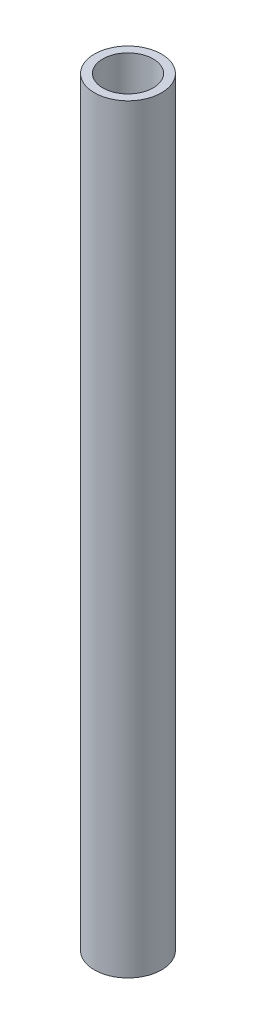
ISO-10303-21;
HEADER;
FILE_DESCRIPTION(('STEP AP214'),'2;1');
FILE_NAME('part.step','',(''),(''),'','','');
FILE_SCHEMA(('AUTOMOTIVE_DESIGN { 1 0 10303 214 1 1 1 1 }'));
ENDSEC;
DATA;
#1=APPLICATION_CONTEXT('core data for automotive mechanical design processes');
#2=APPLICATION_PROTOCOL_DEFINITION('international standard','automotive_design',2000,#1);
#3=PRODUCT_CONTEXT('',#1,'mechanical');
#4=PRODUCT('Part','Part','',(#3));
#5=PRODUCT_RELATED_PRODUCT_CATEGORY('part','',(#4));
#6=PRODUCT_DEFINITION_FORMATION('','',#4);
#7=PRODUCT_DEFINITION_CONTEXT('part definition',#1,'design');
#8=PRODUCT_DEFINITION('design','',#6,#7);
#9=PRODUCT_DEFINITION_SHAPE('','',#8);
#10=(LENGTH_UNIT() NAMED_UNIT(*) SI_UNIT(.MILLI.,.METRE.));
#11=(NAMED_UNIT(*) PLANE_ANGLE_UNIT() SI_UNIT($,.RADIAN.));
#12=(NAMED_UNIT(*) SI_UNIT($,.STERADIAN.) SOLID_ANGLE_UNIT());
#13=UNCERTAINTY_MEASURE_WITH_UNIT(LENGTH_MEASURE(1.E-05),#10,'distance_accuracy_value','');
#14=(GEOMETRIC_REPRESENTATION_CONTEXT(3) GLOBAL_UNCERTAINTY_ASSIGNED_CONTEXT((#13)) GLOBAL_UNIT_ASSIGNED_CONTEXT((#10,
#11,#12)) REPRESENTATION_CONTEXT('',''));
#15=CARTESIAN_POINT('',(0.,0.,0.));
#16=DIRECTION('',(0.,0.,1.));
#17=DIRECTION('',(1.,0.,0.));
#18=AXIS2_PLACEMENT_3D('',#15,#16,#17);
#19=CARTESIAN_POINT('',(0.,90.5,0.));
#20=DIRECTION('',(0.,1.,0.));
#21=DIRECTION('',(0.,0.,1.));
#22=AXIS2_PLACEMENT_3D('',#19,#20,#21);
#23=PLANE('',#22);
#24=CARTESIAN_POINT('',(0.,90.5,0.));
#25=DIRECTION('',(0.,1.,0.));
#26=DIRECTION('',(0.,0.,1.));
#27=AXIS2_PLACEMENT_3D('',#24,#25,#26);
#28=CIRCLE('',#27,4.);
#29=CARTESIAN_POINT('',(0.,90.5,4.));
#30=VERTEX_POINT('',#29);
#31=EDGE_CURVE('E10',#30,#30,#28,.T.);
#32=ORIENTED_EDGE('',*,*,#31,.T.);
#33=EDGE_LOOP('',(#32));
#34=FACE_BOUND('',#33,.T.);
#35=CARTESIAN_POINT('',(0.,90.5,0.));
#36=DIRECTION('',(0.,1.,0.));
#37=DIRECTION('',(0.,0.,1.));
#38=AXIS2_PLACEMENT_3D('',#35,#36,#37);
#39=CIRCLE('',#38,3.);
#40=CARTESIAN_POINT('',(0.,90.5,3.));
#41=VERTEX_POINT('',#40);
#42=EDGE_CURVE('E42',#41,#41,#39,.T.);
#43=ORIENTED_EDGE('',*,*,#42,.F.);
#44=EDGE_LOOP('',(#43));
#45=FACE_BOUND('',#44,.T.);
#46=ADVANCED_FACE('F31',(#34,#45),#23,.T.);
#47=CARTESIAN_POINT('',(0.,0.,0.));
#48=DIRECTION('',(0.,1.,0.));
#49=DIRECTION('',(0.,0.,1.));
#50=AXIS2_PLACEMENT_3D('',#47,#48,#49);
#51=PLANE('',#50);
#52=CARTESIAN_POINT('',(0.,0.,0.));
#53=DIRECTION('',(0.,1.,0.));
#54=DIRECTION('',(0.,0.,1.));
#55=AXIS2_PLACEMENT_3D('',#52,#53,#54);
#56=CIRCLE('',#55,4.);
#57=CARTESIAN_POINT('',(0.,0.,4.));
#58=VERTEX_POINT('',#57);
#59=EDGE_CURVE('E35',#58,#58,#56,.T.);
#60=ORIENTED_EDGE('',*,*,#59,.F.);
#61=EDGE_LOOP('',(#60));
#62=FACE_BOUND('',#61,.T.);
#63=CARTESIAN_POINT('',(0.,0.,0.));
#64=DIRECTION('',(0.,1.,0.));
#65=DIRECTION('',(0.,0.,1.));
#66=AXIS2_PLACEMENT_3D('',#63,#64,#65);
#67=CIRCLE('',#66,3.);
#68=CARTESIAN_POINT('',(0.,0.,3.));
#69=VERTEX_POINT('',#68);
#70=EDGE_CURVE('E44',#69,#69,#67,.T.);
#71=ORIENTED_EDGE('',*,*,#70,.T.);
#72=EDGE_LOOP('',(#71));
#73=FACE_BOUND('',#72,.T.);
#74=ADVANCED_FACE('F54',(#62,#73),#51,.F.);
#75=CARTESIAN_POINT('',(0.,90.5,0.));
#76=DIRECTION('',(0.,-1.,0.));
#77=DIRECTION('',(0.,0.,-1.));
#78=AXIS2_PLACEMENT_3D('',#75,#76,#77);
#79=CYLINDRICAL_SURFACE('',#78,4.);
#80=ORIENTED_EDGE('',*,*,#31,.F.);
#81=EDGE_LOOP('',(#80));
#82=FACE_BOUND('',#81,.T.);
#83=ORIENTED_EDGE('',*,*,#59,.T.);
#84=EDGE_LOOP('',(#83));
#85=FACE_BOUND('',#84,.T.);
#86=ADVANCED_FACE('F33',(#82,#85),#79,.T.);
#87=CARTESIAN_POINT('',(0.,90.5,0.));
#88=DIRECTION('',(0.,-1.,0.));
#89=DIRECTION('',(0.,0.,-1.));
#90=AXIS2_PLACEMENT_3D('',#87,#88,#89);
#91=CYLINDRICAL_SURFACE('',#90,3.);
#92=ORIENTED_EDGE('',*,*,#42,.T.);
#93=EDGE_LOOP('',(#92));
#94=FACE_BOUND('',#93,.T.);
#95=ORIENTED_EDGE('',*,*,#70,.F.);
#96=EDGE_LOOP('',(#95));
#97=FACE_BOUND('',#96,.T.);
#98=ADVANCED_FACE('F50',(#94,#97),#91,.F.);
#99=CLOSED_SHELL('',(#46,#74,#86,#98));
#100=MANIFOLD_SOLID_BREP('B2',#99);
#101=ADVANCED_BREP_SHAPE_REPRESENTATION('',(#18,#100),#14);
#102=SHAPE_DEFINITION_REPRESENTATION(#9,#101);
ENDSEC;
END-ISO-10303-21;
